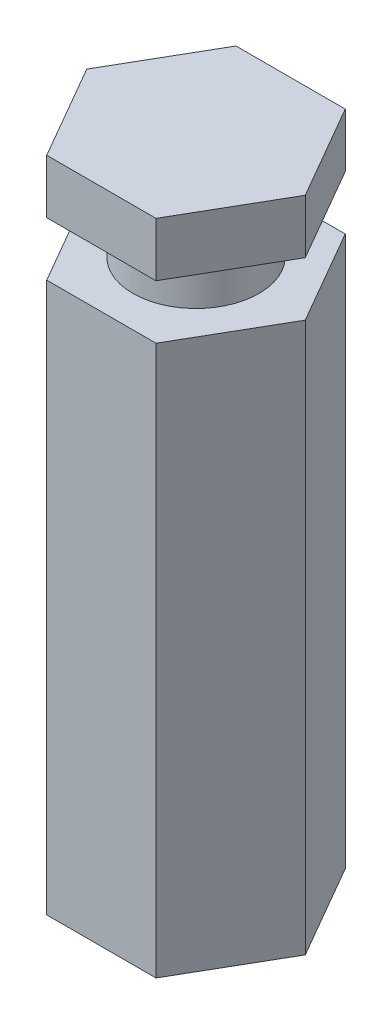
ISO-10303-21;
HEADER;
FILE_DESCRIPTION(('STEP AP214'),'2;1');
FILE_NAME('part.step','',(''),(''),'','','');
FILE_SCHEMA(('AUTOMOTIVE_DESIGN { 1 0 10303 214 1 1 1 1 }'));
ENDSEC;
DATA;
#1=APPLICATION_CONTEXT('core data for automotive mechanical design processes');
#2=APPLICATION_PROTOCOL_DEFINITION('international standard','automotive_design',2000,#1);
#3=PRODUCT_CONTEXT('',#1,'mechanical');
#4=PRODUCT('Part','Part','',(#3));
#5=PRODUCT_RELATED_PRODUCT_CATEGORY('part','',(#4));
#6=PRODUCT_DEFINITION_FORMATION('','',#4);
#7=PRODUCT_DEFINITION_CONTEXT('part definition',#1,'design');
#8=PRODUCT_DEFINITION('design','',#6,#7);
#9=PRODUCT_DEFINITION_SHAPE('','',#8);
#10=(LENGTH_UNIT() NAMED_UNIT(*) SI_UNIT(.MILLI.,.METRE.));
#11=(NAMED_UNIT(*) PLANE_ANGLE_UNIT() SI_UNIT($,.RADIAN.));
#12=(NAMED_UNIT(*) SI_UNIT($,.STERADIAN.) SOLID_ANGLE_UNIT());
#13=UNCERTAINTY_MEASURE_WITH_UNIT(LENGTH_MEASURE(1.E-05),#10,'distance_accuracy_value','');
#14=(GEOMETRIC_REPRESENTATION_CONTEXT(3) GLOBAL_UNCERTAINTY_ASSIGNED_CONTEXT((#13)) GLOBAL_UNIT_ASSIGNED_CONTEXT((#10,
#11,#12)) REPRESENTATION_CONTEXT('',''));
#15=CARTESIAN_POINT('',(0.,0.,0.));
#16=DIRECTION('',(0.,0.,1.));
#17=DIRECTION('',(1.,0.,0.));
#18=AXIS2_PLACEMENT_3D('',#15,#16,#17);
#19=CARTESIAN_POINT('',(0.,61.,10.5));
#20=DIRECTION('',(0.,0.,-1.));
#21=DIRECTION('',(-1.,0.,0.));
#22=AXIS2_PLACEMENT_3D('',#19,#20,#21);
#23=PLANE('',#22);
#24=DIRECTION('',(1.,0.,0.));
#25=VECTOR('',#24,1.);
#26=CARTESIAN_POINT('',(0.,0.,10.5));
#27=LINE('',#26,#25);
#28=CARTESIAN_POINT('',(-6.06217782649107,0.,10.5));
#29=VERTEX_POINT('',#28);
#30=CARTESIAN_POINT('',(6.06217782649107,0.,10.5));
#31=VERTEX_POINT('',#30);
#32=EDGE_CURVE('E138',#29,#31,#27,.T.);
#33=ORIENTED_EDGE('',*,*,#32,.T.);
#34=DIRECTION('',(0.,-1.,0.));
#35=VECTOR('',#34,1.);
#36=CARTESIAN_POINT('',(6.06217782649107,61.,10.5));
#37=LINE('',#36,#35);
#38=CARTESIAN_POINT('',(6.06217782649107,61.,10.5));
#39=VERTEX_POINT('',#38);
#40=EDGE_CURVE('E11',#39,#31,#37,.T.);
#41=ORIENTED_EDGE('',*,*,#40,.F.);
#42=DIRECTION('',(1.,0.,0.));
#43=VECTOR('',#42,1.);
#44=CARTESIAN_POINT('',(0.,61.,10.5));
#45=LINE('',#44,#43);
#46=CARTESIAN_POINT('',(-6.06217782649107,61.,10.5));
#47=VERTEX_POINT('',#46);
#48=EDGE_CURVE('E155',#47,#39,#45,.T.);
#49=ORIENTED_EDGE('',*,*,#48,.F.);
#50=DIRECTION('',(0.,-1.,0.));
#51=VECTOR('',#50,1.);
#52=CARTESIAN_POINT('',(-6.06217782649107,61.,10.5));
#53=LINE('',#52,#51);
#54=EDGE_CURVE('E134',#47,#29,#53,.T.);
#55=ORIENTED_EDGE('',*,*,#54,.T.);
#56=EDGE_LOOP('',(#33,#41,#49,#55));
#57=FACE_BOUND('',#56,.T.);
#58=ADVANCED_FACE('F45',(#57),#23,.F.);
#59=CARTESIAN_POINT('',(9.09326673973661,61.,5.25));
#60=DIRECTION('',(-0.866025403784439,0.,-0.5));
#61=DIRECTION('',(-0.5,0.,0.866025403784439));
#62=AXIS2_PLACEMENT_3D('',#59,#60,#61);
#63=PLANE('',#62);
#64=DIRECTION('',(0.5,0.,-0.866025403784439));
#65=VECTOR('',#64,1.);
#66=CARTESIAN_POINT('',(9.09326673973661,0.,5.25));
#67=LINE('',#66,#65);
#68=CARTESIAN_POINT('',(12.1243556529821,0.,0.));
#69=VERTEX_POINT('',#68);
#70=EDGE_CURVE('E142',#31,#69,#67,.T.);
#71=ORIENTED_EDGE('',*,*,#70,.T.);
#72=DIRECTION('',(0.,-1.,0.));
#73=VECTOR('',#72,1.);
#74=CARTESIAN_POINT('',(12.1243556529821,61.,0.));
#75=LINE('',#74,#73);
#76=CARTESIAN_POINT('',(12.1243556529821,61.,0.));
#77=VERTEX_POINT('',#76);
#78=EDGE_CURVE('E54',#77,#69,#75,.T.);
#79=ORIENTED_EDGE('',*,*,#78,.F.);
#80=DIRECTION('',(0.5,0.,-0.866025403784439));
#81=VECTOR('',#80,1.);
#82=CARTESIAN_POINT('',(9.09326673973661,61.,5.25));
#83=LINE('',#82,#81);
#84=EDGE_CURVE('E100',#39,#77,#83,.T.);
#85=ORIENTED_EDGE('',*,*,#84,.F.);
#86=ORIENTED_EDGE('',*,*,#40,.T.);
#87=EDGE_LOOP('',(#71,#79,#85,#86));
#88=FACE_BOUND('',#87,.T.);
#89=ADVANCED_FACE('F184',(#88),#63,.F.);
#90=CARTESIAN_POINT('',(9.09326673973661,61.,-5.25));
#91=DIRECTION('',(-0.866025403784439,0.,0.5));
#92=DIRECTION('',(0.5,0.,0.866025403784439));
#93=AXIS2_PLACEMENT_3D('',#90,#91,#92);
#94=PLANE('',#93);
#95=DIRECTION('',(-0.5,0.,-0.866025403784439));
#96=VECTOR('',#95,1.);
#97=CARTESIAN_POINT('',(9.09326673973661,0.,-5.25));
#98=LINE('',#97,#96);
#99=CARTESIAN_POINT('',(6.06217782649107,0.,-10.5));
#100=VERTEX_POINT('',#99);
#101=EDGE_CURVE('E146',#69,#100,#98,.T.);
#102=ORIENTED_EDGE('',*,*,#101,.T.);
#103=DIRECTION('',(0.,-1.,0.));
#104=VECTOR('',#103,1.);
#105=CARTESIAN_POINT('',(6.06217782649107,61.,-10.5));
#106=LINE('',#105,#104);
#107=CARTESIAN_POINT('',(6.06217782649107,61.,-10.5));
#108=VERTEX_POINT('',#107);
#109=EDGE_CURVE('E127',#108,#100,#106,.T.);
#110=ORIENTED_EDGE('',*,*,#109,.F.);
#111=DIRECTION('',(-0.5,0.,-0.866025403784439));
#112=VECTOR('',#111,1.);
#113=CARTESIAN_POINT('',(9.09326673973661,61.,-5.25));
#114=LINE('',#113,#112);
#115=EDGE_CURVE('E116',#77,#108,#114,.T.);
#116=ORIENTED_EDGE('',*,*,#115,.F.);
#117=ORIENTED_EDGE('',*,*,#78,.T.);
#118=EDGE_LOOP('',(#102,#110,#116,#117));
#119=FACE_BOUND('',#118,.T.);
#120=ADVANCED_FACE('F165',(#119),#94,.F.);
#121=CARTESIAN_POINT('',(0.,61.,-10.5));
#122=DIRECTION('',(0.,0.,1.));
#123=DIRECTION('',(1.,0.,0.));
#124=AXIS2_PLACEMENT_3D('',#121,#122,#123);
#125=PLANE('',#124);
#126=DIRECTION('',(-1.,0.,0.));
#127=VECTOR('',#126,1.);
#128=CARTESIAN_POINT('',(0.,0.,-10.5));
#129=LINE('',#128,#127);
#130=CARTESIAN_POINT('',(-6.06217782649107,0.,-10.5));
#131=VERTEX_POINT('',#130);
#132=EDGE_CURVE('E125',#100,#131,#129,.T.);
#133=ORIENTED_EDGE('',*,*,#132,.T.);
#134=DIRECTION('',(0.,-1.,0.));
#135=VECTOR('',#134,1.);
#136=CARTESIAN_POINT('',(-6.06217782649107,61.,-10.5));
#137=LINE('',#136,#135);
#138=CARTESIAN_POINT('',(-6.06217782649107,61.,-10.5));
#139=VERTEX_POINT('',#138);
#140=EDGE_CURVE('E122',#139,#131,#137,.T.);
#141=ORIENTED_EDGE('',*,*,#140,.F.);
#142=DIRECTION('',(-1.,0.,0.));
#143=VECTOR('',#142,1.);
#144=CARTESIAN_POINT('',(0.,61.,-10.5));
#145=LINE('',#144,#143);
#146=EDGE_CURVE('E110',#108,#139,#145,.T.);
#147=ORIENTED_EDGE('',*,*,#146,.F.);
#148=ORIENTED_EDGE('',*,*,#109,.T.);
#149=EDGE_LOOP('',(#133,#141,#147,#148));
#150=FACE_BOUND('',#149,.T.);
#151=ADVANCED_FACE('F123',(#150),#125,.F.);
#152=CARTESIAN_POINT('',(-9.09326673973661,61.,-5.25));
#153=DIRECTION('',(0.866025403784439,0.,0.5));
#154=DIRECTION('',(0.5,0.,-0.866025403784439));
#155=AXIS2_PLACEMENT_3D('',#152,#153,#154);
#156=PLANE('',#155);
#157=DIRECTION('',(-0.5,0.,0.866025403784439));
#158=VECTOR('',#157,1.);
#159=CARTESIAN_POINT('',(-9.09326673973661,0.,-5.25));
#160=LINE('',#159,#158);
#161=CARTESIAN_POINT('',(-12.1243556529821,0.,0.));
#162=VERTEX_POINT('',#161);
#163=EDGE_CURVE('E86',#131,#162,#160,.T.);
#164=ORIENTED_EDGE('',*,*,#163,.T.);
#165=DIRECTION('',(0.,-1.,0.));
#166=VECTOR('',#165,1.);
#167=CARTESIAN_POINT('',(-12.1243556529821,61.,0.));
#168=LINE('',#167,#166);
#169=CARTESIAN_POINT('',(-12.1243556529821,61.,0.));
#170=VERTEX_POINT('',#169);
#171=EDGE_CURVE('E128',#170,#162,#168,.T.);
#172=ORIENTED_EDGE('',*,*,#171,.F.);
#173=DIRECTION('',(-0.5,0.,0.866025403784439));
#174=VECTOR('',#173,1.);
#175=CARTESIAN_POINT('',(-9.09326673973661,61.,-5.25));
#176=LINE('',#175,#174);
#177=EDGE_CURVE('E114',#139,#170,#176,.T.);
#178=ORIENTED_EDGE('',*,*,#177,.F.);
#179=ORIENTED_EDGE('',*,*,#140,.T.);
#180=EDGE_LOOP('',(#164,#172,#178,#179));
#181=FACE_BOUND('',#180,.T.);
#182=ADVANCED_FACE('F130',(#181),#156,.F.);
#183=CARTESIAN_POINT('',(-9.0932667397366,61.,5.25));
#184=DIRECTION('',(0.866025403784439,0.,-0.5));
#185=DIRECTION('',(-0.5,0.,-0.866025403784439));
#186=AXIS2_PLACEMENT_3D('',#183,#184,#185);
#187=PLANE('',#186);
#188=DIRECTION('',(0.5,0.,0.866025403784439));
#189=VECTOR('',#188,1.);
#190=CARTESIAN_POINT('',(-9.0932667397366,0.,5.25));
#191=LINE('',#190,#189);
#192=EDGE_CURVE('E92',#162,#29,#191,.T.);
#193=ORIENTED_EDGE('',*,*,#192,.T.);
#194=ORIENTED_EDGE('',*,*,#54,.F.);
#195=DIRECTION('',(0.5,0.,0.866025403784439));
#196=VECTOR('',#195,1.);
#197=CARTESIAN_POINT('',(-9.0932667397366,61.,5.25));
#198=LINE('',#197,#196);
#199=EDGE_CURVE('E62',#170,#47,#198,.T.);
#200=ORIENTED_EDGE('',*,*,#199,.F.);
#201=ORIENTED_EDGE('',*,*,#171,.T.);
#202=EDGE_LOOP('',(#193,#194,#200,#201));
#203=FACE_BOUND('',#202,.T.);
#204=ADVANCED_FACE('F172',(#203),#187,.F.);
#205=CARTESIAN_POINT('',(0.,61.,0.));
#206=DIRECTION('',(0.,1.,0.));
#207=DIRECTION('',(0.,0.,1.));
#208=AXIS2_PLACEMENT_3D('',#205,#206,#207);
#209=PLANE('',#208);
#210=CARTESIAN_POINT('',(0.,61.,0.));
#211=DIRECTION('',(0.,1.,0.));
#212=DIRECTION('',(0.,0.,1.));
#213=AXIS2_PLACEMENT_3D('',#210,#211,#212);
#214=CIRCLE('',#213,7.);
#215=CARTESIAN_POINT('',(0.,61.,7.));
#216=VERTEX_POINT('',#215);
#217=EDGE_CURVE('E143',#216,#216,#214,.F.);
#218=ORIENTED_EDGE('',*,*,#217,.T.);
#219=EDGE_LOOP('',(#218));
#220=FACE_BOUND('',#219,.T.);
#221=ORIENTED_EDGE('',*,*,#48,.T.);
#222=ORIENTED_EDGE('',*,*,#84,.T.);
#223=ORIENTED_EDGE('',*,*,#115,.T.);
#224=ORIENTED_EDGE('',*,*,#146,.T.);
#225=ORIENTED_EDGE('',*,*,#177,.T.);
#226=ORIENTED_EDGE('',*,*,#199,.T.);
#227=EDGE_LOOP('',(#221,#222,#223,#224,#225,#226));
#228=FACE_BOUND('',#227,.T.);
#229=ADVANCED_FACE('F112',(#220,#228),#209,.T.);
#230=CARTESIAN_POINT('',(0.,0.,0.));
#231=DIRECTION('',(0.,1.,0.));
#232=DIRECTION('',(0.,0.,1.));
#233=AXIS2_PLACEMENT_3D('',#230,#231,#232);
#234=PLANE('',#233);
#235=ORIENTED_EDGE('',*,*,#32,.F.);
#236=ORIENTED_EDGE('',*,*,#192,.F.);
#237=ORIENTED_EDGE('',*,*,#163,.F.);
#238=ORIENTED_EDGE('',*,*,#132,.F.);
#239=ORIENTED_EDGE('',*,*,#101,.F.);
#240=ORIENTED_EDGE('',*,*,#70,.F.);
#241=EDGE_LOOP('',(#235,#236,#237,#238,#239,#240));
#242=FACE_BOUND('',#241,.T.);
#243=ADVANCED_FACE('F168',(#242),#234,.F.);
#244=CARTESIAN_POINT('',(0.,67.,0.));
#245=DIRECTION('',(0.,-1.,0.));
#246=DIRECTION('',(0.,0.,-1.));
#247=AXIS2_PLACEMENT_3D('',#244,#245,#246);
#248=CYLINDRICAL_SURFACE('',#247,7.);
#249=ORIENTED_EDGE('',*,*,#217,.F.);
#250=EDGE_LOOP('',(#249));
#251=FACE_BOUND('',#250,.T.);
#252=CARTESIAN_POINT('',(0.,67.,0.));
#253=DIRECTION('',(0.,1.,0.));
#254=DIRECTION('',(0.,0.,1.));
#255=AXIS2_PLACEMENT_3D('',#252,#253,#254);
#256=CIRCLE('',#255,7.);
#257=CARTESIAN_POINT('',(0.,67.,7.));
#258=VERTEX_POINT('',#257);
#259=EDGE_CURVE('E317',#258,#258,#256,.T.);
#260=ORIENTED_EDGE('',*,*,#259,.F.);
#261=EDGE_LOOP('',(#260));
#262=FACE_BOUND('',#261,.T.);
#263=ADVANCED_FACE('F223',(#251,#262),#248,.T.);
#264=CARTESIAN_POINT('',(-9.09326673973661,73.,-5.25));
#265=DIRECTION('',(-0.866025403784439,0.,-0.5));
#266=DIRECTION('',(-0.5,0.,0.866025403784439));
#267=AXIS2_PLACEMENT_3D('',#264,#265,#266);
#268=PLANE('',#267);
#269=DIRECTION('',(0.5,0.,-0.866025403784439));
#270=VECTOR('',#269,1.);
#271=CARTESIAN_POINT('',(-9.09326673973661,67.,-5.25));
#272=LINE('',#271,#270);
#273=CARTESIAN_POINT('',(-12.1243556529821,67.,0.));
#274=VERTEX_POINT('',#273);
#275=CARTESIAN_POINT('',(-6.06217782649107,67.,-10.5));
#276=VERTEX_POINT('',#275);
#277=EDGE_CURVE('E323',#274,#276,#272,.T.);
#278=ORIENTED_EDGE('',*,*,#277,.F.);
#279=DIRECTION('',(0.,-1.,0.));
#280=VECTOR('',#279,1.);
#281=CARTESIAN_POINT('',(-12.1243556529821,73.,0.));
#282=LINE('',#281,#280);
#283=CARTESIAN_POINT('',(-12.1243556529821,73.,0.));
#284=VERTEX_POINT('',#283);
#285=EDGE_CURVE('E355',#284,#274,#282,.T.);
#286=ORIENTED_EDGE('',*,*,#285,.F.);
#287=DIRECTION('',(0.5,0.,-0.866025403784439));
#288=VECTOR('',#287,1.);
#289=CARTESIAN_POINT('',(-9.09326673973661,73.,-5.25));
#290=LINE('',#289,#288);
#291=CARTESIAN_POINT('',(-6.06217782649107,73.,-10.5));
#292=VERTEX_POINT('',#291);
#293=EDGE_CURVE('E354',#284,#292,#290,.T.);
#294=ORIENTED_EDGE('',*,*,#293,.T.);
#295=DIRECTION('',(0.,-1.,0.));
#296=VECTOR('',#295,1.);
#297=CARTESIAN_POINT('',(-6.06217782649107,73.,-10.5));
#298=LINE('',#297,#296);
#299=EDGE_CURVE('E375',#292,#276,#298,.T.);
#300=ORIENTED_EDGE('',*,*,#299,.T.);
#301=EDGE_LOOP('',(#278,#286,#294,#300));
#302=FACE_BOUND('',#301,.T.);
#303=ADVANCED_FACE('F231',(#302),#268,.T.);
#304=CARTESIAN_POINT('',(-9.0932667397366,73.,5.25));
#305=DIRECTION('',(-0.866025403784439,0.,0.5));
#306=DIRECTION('',(0.5,0.,0.866025403784439));
#307=AXIS2_PLACEMENT_3D('',#304,#305,#306);
#308=PLANE('',#307);
#309=DIRECTION('',(-0.5,0.,-0.866025403784439));
#310=VECTOR('',#309,1.);
#311=CARTESIAN_POINT('',(-9.0932667397366,67.,5.25));
#312=LINE('',#311,#310);
#313=CARTESIAN_POINT('',(-6.06217782649107,67.,10.5));
#314=VERTEX_POINT('',#313);
#315=EDGE_CURVE('E330',#314,#274,#312,.T.);
#316=ORIENTED_EDGE('',*,*,#315,.F.);
#317=DIRECTION('',(0.,-1.,0.));
#318=VECTOR('',#317,1.);
#319=CARTESIAN_POINT('',(-6.06217782649107,73.,10.5));
#320=LINE('',#319,#318);
#321=CARTESIAN_POINT('',(-6.06217782649107,73.,10.5));
#322=VERTEX_POINT('',#321);
#323=EDGE_CURVE('E359',#322,#314,#320,.T.);
#324=ORIENTED_EDGE('',*,*,#323,.F.);
#325=DIRECTION('',(-0.5,0.,-0.866025403784439));
#326=VECTOR('',#325,1.);
#327=CARTESIAN_POINT('',(-9.0932667397366,73.,5.25));
#328=LINE('',#327,#326);
#329=EDGE_CURVE('E340',#322,#284,#328,.T.);
#330=ORIENTED_EDGE('',*,*,#329,.T.);
#331=ORIENTED_EDGE('',*,*,#285,.T.);
#332=EDGE_LOOP('',(#316,#324,#330,#331));
#333=FACE_BOUND('',#332,.T.);
#334=ADVANCED_FACE('F241',(#333),#308,.T.);
#335=CARTESIAN_POINT('',(0.,73.,10.5));
#336=DIRECTION('',(0.,0.,1.));
#337=DIRECTION('',(1.,0.,0.));
#338=AXIS2_PLACEMENT_3D('',#335,#336,#337);
#339=PLANE('',#338);
#340=DIRECTION('',(-1.,0.,0.));
#341=VECTOR('',#340,1.);
#342=CARTESIAN_POINT('',(0.,67.,10.5));
#343=LINE('',#342,#341);
#344=CARTESIAN_POINT('',(6.06217782649107,67.,10.5));
#345=VERTEX_POINT('',#344);
#346=EDGE_CURVE('E349',#345,#314,#343,.T.);
#347=ORIENTED_EDGE('',*,*,#346,.F.);
#348=DIRECTION('',(0.,-1.,0.));
#349=VECTOR('',#348,1.);
#350=CARTESIAN_POINT('',(6.06217782649107,73.,10.5));
#351=LINE('',#350,#349);
#352=CARTESIAN_POINT('',(6.06217782649107,73.,10.5));
#353=VERTEX_POINT('',#352);
#354=EDGE_CURVE('E363',#353,#345,#351,.T.);
#355=ORIENTED_EDGE('',*,*,#354,.F.);
#356=DIRECTION('',(-1.,0.,0.));
#357=VECTOR('',#356,1.);
#358=CARTESIAN_POINT('',(0.,73.,10.5));
#359=LINE('',#358,#357);
#360=EDGE_CURVE('E390',#353,#322,#359,.T.);
#361=ORIENTED_EDGE('',*,*,#360,.T.);
#362=ORIENTED_EDGE('',*,*,#323,.T.);
#363=EDGE_LOOP('',(#347,#355,#361,#362));
#364=FACE_BOUND('',#363,.T.);
#365=ADVANCED_FACE('F251',(#364),#339,.T.);
#366=CARTESIAN_POINT('',(9.09326673973661,73.,5.25));
#367=DIRECTION('',(0.866025403784439,0.,0.5));
#368=DIRECTION('',(0.5,0.,-0.866025403784439));
#369=AXIS2_PLACEMENT_3D('',#366,#367,#368);
#370=PLANE('',#369);
#371=DIRECTION('',(-0.5,0.,0.866025403784439));
#372=VECTOR('',#371,1.);
#373=CARTESIAN_POINT('',(9.09326673973661,67.,5.25));
#374=LINE('',#373,#372);
#375=CARTESIAN_POINT('',(12.1243556529821,67.,0.));
#376=VERTEX_POINT('',#375);
#377=EDGE_CURVE('E345',#376,#345,#374,.T.);
#378=ORIENTED_EDGE('',*,*,#377,.F.);
#379=DIRECTION('',(0.,-1.,0.));
#380=VECTOR('',#379,1.);
#381=CARTESIAN_POINT('',(12.1243556529821,73.,0.));
#382=LINE('',#381,#380);
#383=CARTESIAN_POINT('',(12.1243556529821,73.,0.));
#384=VERTEX_POINT('',#383);
#385=EDGE_CURVE('E367',#384,#376,#382,.T.);
#386=ORIENTED_EDGE('',*,*,#385,.F.);
#387=DIRECTION('',(-0.5,0.,0.866025403784439));
#388=VECTOR('',#387,1.);
#389=CARTESIAN_POINT('',(9.09326673973661,73.,5.25));
#390=LINE('',#389,#388);
#391=EDGE_CURVE('E393',#384,#353,#390,.T.);
#392=ORIENTED_EDGE('',*,*,#391,.T.);
#393=ORIENTED_EDGE('',*,*,#354,.T.);
#394=EDGE_LOOP('',(#378,#386,#392,#393));
#395=FACE_BOUND('',#394,.T.);
#396=ADVANCED_FACE('F261',(#395),#370,.T.);
#397=CARTESIAN_POINT('',(9.09326673973661,73.,-5.25));
#398=DIRECTION('',(0.866025403784439,0.,-0.5));
#399=DIRECTION('',(-0.5,0.,-0.866025403784439));
#400=AXIS2_PLACEMENT_3D('',#397,#398,#399);
#401=PLANE('',#400);
#402=DIRECTION('',(0.5,0.,0.866025403784439));
#403=VECTOR('',#402,1.);
#404=CARTESIAN_POINT('',(9.09326673973661,67.,-5.25));
#405=LINE('',#404,#403);
#406=CARTESIAN_POINT('',(6.06217782649107,67.,-10.5));
#407=VERTEX_POINT('',#406);
#408=EDGE_CURVE('E337',#407,#376,#405,.T.);
#409=ORIENTED_EDGE('',*,*,#408,.F.);
#410=DIRECTION('',(0.,-1.,0.));
#411=VECTOR('',#410,1.);
#412=CARTESIAN_POINT('',(6.06217782649107,73.,-10.5));
#413=LINE('',#412,#411);
#414=CARTESIAN_POINT('',(6.06217782649107,73.,-10.5));
#415=VERTEX_POINT('',#414);
#416=EDGE_CURVE('E371',#415,#407,#413,.T.);
#417=ORIENTED_EDGE('',*,*,#416,.F.);
#418=DIRECTION('',(0.5,0.,0.866025403784439));
#419=VECTOR('',#418,1.);
#420=CARTESIAN_POINT('',(9.09326673973661,73.,-5.25));
#421=LINE('',#420,#419);
#422=EDGE_CURVE('E396',#415,#384,#421,.T.);
#423=ORIENTED_EDGE('',*,*,#422,.T.);
#424=ORIENTED_EDGE('',*,*,#385,.T.);
#425=EDGE_LOOP('',(#409,#417,#423,#424));
#426=FACE_BOUND('',#425,.T.);
#427=ADVANCED_FACE('F271',(#426),#401,.T.);
#428=CARTESIAN_POINT('',(0.,73.,-10.5));
#429=DIRECTION('',(0.,0.,-1.));
#430=DIRECTION('',(-1.,0.,0.));
#431=AXIS2_PLACEMENT_3D('',#428,#429,#430);
#432=PLANE('',#431);
#433=DIRECTION('',(1.,0.,0.));
#434=VECTOR('',#433,1.);
#435=CARTESIAN_POINT('',(0.,67.,-10.5));
#436=LINE('',#435,#434);
#437=EDGE_CURVE('E327',#276,#407,#436,.T.);
#438=ORIENTED_EDGE('',*,*,#437,.F.);
#439=ORIENTED_EDGE('',*,*,#299,.F.);
#440=DIRECTION('',(1.,0.,0.));
#441=VECTOR('',#440,1.);
#442=CARTESIAN_POINT('',(0.,73.,-10.5));
#443=LINE('',#442,#441);
#444=EDGE_CURVE('E400',#292,#415,#443,.T.);
#445=ORIENTED_EDGE('',*,*,#444,.T.);
#446=ORIENTED_EDGE('',*,*,#416,.T.);
#447=EDGE_LOOP('',(#438,#439,#445,#446));
#448=FACE_BOUND('',#447,.T.);
#449=ADVANCED_FACE('F281',(#448),#432,.T.);
#450=CARTESIAN_POINT('',(0.,73.,0.));
#451=DIRECTION('',(0.,-1.,0.));
#452=DIRECTION('',(0.,0.,-1.));
#453=AXIS2_PLACEMENT_3D('',#450,#451,#452);
#454=PLANE('',#453);
#455=ORIENTED_EDGE('',*,*,#293,.F.);
#456=ORIENTED_EDGE('',*,*,#329,.F.);
#457=ORIENTED_EDGE('',*,*,#360,.F.);
#458=ORIENTED_EDGE('',*,*,#391,.F.);
#459=ORIENTED_EDGE('',*,*,#422,.F.);
#460=ORIENTED_EDGE('',*,*,#444,.F.);
#461=EDGE_LOOP('',(#455,#456,#457,#458,#459,#460));
#462=FACE_BOUND('',#461,.T.);
#463=ADVANCED_FACE('F291',(#462),#454,.F.);
#464=CARTESIAN_POINT('',(0.,67.,0.));
#465=DIRECTION('',(0.,-1.,0.));
#466=DIRECTION('',(0.,0.,-1.));
#467=AXIS2_PLACEMENT_3D('',#464,#465,#466);
#468=PLANE('',#467);
#469=ORIENTED_EDGE('',*,*,#259,.T.);
#470=EDGE_LOOP('',(#469));
#471=FACE_BOUND('',#470,.T.);
#472=ORIENTED_EDGE('',*,*,#277,.T.);
#473=ORIENTED_EDGE('',*,*,#437,.T.);
#474=ORIENTED_EDGE('',*,*,#408,.T.);
#475=ORIENTED_EDGE('',*,*,#377,.T.);
#476=ORIENTED_EDGE('',*,*,#346,.T.);
#477=ORIENTED_EDGE('',*,*,#315,.T.);
#478=EDGE_LOOP('',(#472,#473,#474,#475,#476,#477));
#479=FACE_BOUND('',#478,.T.);
#480=ADVANCED_FACE('F301',(#471,#479),#468,.T.);
#481=CLOSED_SHELL('',(#58,#89,#120,#151,#182,#204,#229,#243,#263,#303,#334,#365,#396,#427,#449,
#463,#480));
#482=MANIFOLD_SOLID_BREP('B2',#481);
#483=ADVANCED_BREP_SHAPE_REPRESENTATION('',(#18,#482),#14);
#484=SHAPE_DEFINITION_REPRESENTATION(#9,#483);
ENDSEC;
END-ISO-10303-21;
